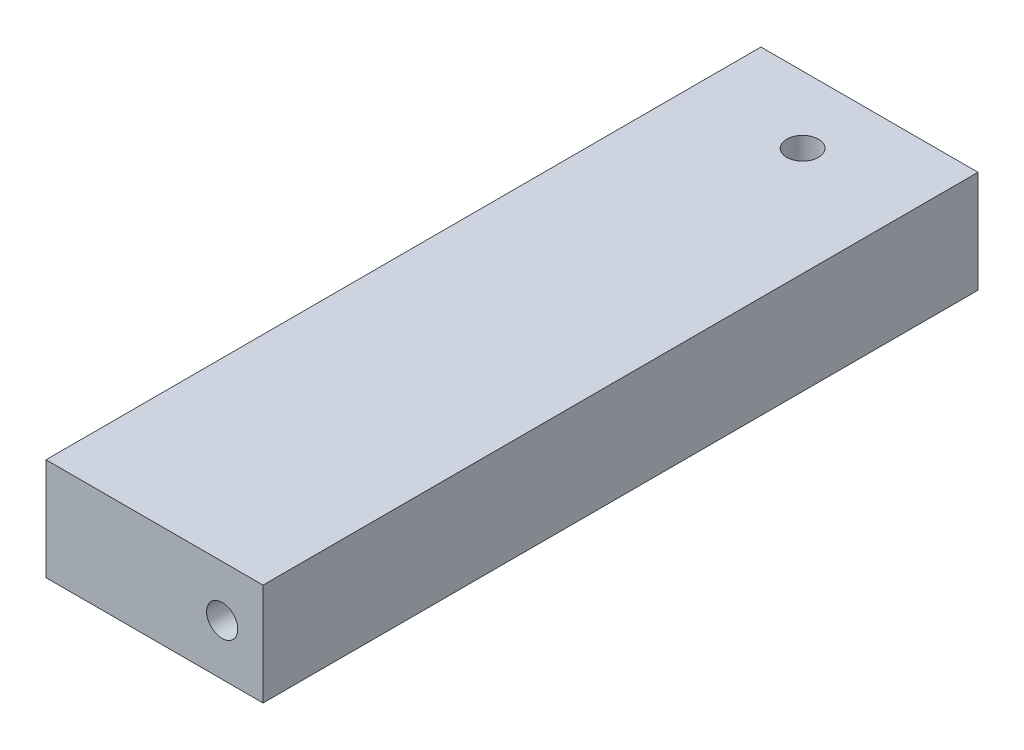
ISO-10303-21;
HEADER;
FILE_DESCRIPTION(('STEP AP214'),'2;1');
FILE_NAME('part.step','',(''),(''),'','','');
FILE_SCHEMA(('AUTOMOTIVE_DESIGN { 1 0 10303 214 1 1 1 1 }'));
ENDSEC;
DATA;
#1=APPLICATION_CONTEXT('core data for automotive mechanical design processes');
#2=APPLICATION_PROTOCOL_DEFINITION('international standard','automotive_design',2000,#1);
#3=PRODUCT_CONTEXT('',#1,'mechanical');
#4=PRODUCT('Part','Part','',(#3));
#5=PRODUCT_RELATED_PRODUCT_CATEGORY('part','',(#4));
#6=PRODUCT_DEFINITION_FORMATION('','',#4);
#7=PRODUCT_DEFINITION_CONTEXT('part definition',#1,'design');
#8=PRODUCT_DEFINITION('design','',#6,#7);
#9=PRODUCT_DEFINITION_SHAPE('','',#8);
#10=(LENGTH_UNIT() NAMED_UNIT(*) SI_UNIT(.MILLI.,.METRE.));
#11=(NAMED_UNIT(*) PLANE_ANGLE_UNIT() SI_UNIT($,.RADIAN.));
#12=(NAMED_UNIT(*) SI_UNIT($,.STERADIAN.) SOLID_ANGLE_UNIT());
#13=UNCERTAINTY_MEASURE_WITH_UNIT(LENGTH_MEASURE(1.E-05),#10,'distance_accuracy_value','');
#14=(GEOMETRIC_REPRESENTATION_CONTEXT(3) GLOBAL_UNCERTAINTY_ASSIGNED_CONTEXT((#13)) GLOBAL_UNIT_ASSIGNED_CONTEXT((#10,
#11,#12)) REPRESENTATION_CONTEXT('',''));
#15=CARTESIAN_POINT('',(0.,0.,0.));
#16=DIRECTION('',(0.,0.,1.));
#17=DIRECTION('',(1.,0.,0.));
#18=AXIS2_PLACEMENT_3D('',#15,#16,#17);
#19=CARTESIAN_POINT('',(-21.2705314009662,11.,-64.118961352657));
#20=DIRECTION('',(1.,0.,0.));
#21=DIRECTION('',(0.,0.,-1.));
#22=AXIS2_PLACEMENT_3D('',#19,#20,#21);
#23=PLANE('',#22);
#24=DIRECTION('',(0.,0.,1.));
#25=VECTOR('',#24,1.);
#26=CARTESIAN_POINT('',(-21.2705314009662,-9.,-64.118961352657));
#27=LINE('',#26,#25);
#28=CARTESIAN_POINT('',(-21.2705314009662,-9.,-64.118961352657));
#29=VERTEX_POINT('',#28);
#30=CARTESIAN_POINT('',(-21.2705314009662,-9.,75.881038647343));
#31=VERTEX_POINT('',#30);
#32=EDGE_CURVE('E102',#29,#31,#27,.T.);
#33=ORIENTED_EDGE('',*,*,#32,.T.);
#34=DIRECTION('',(0.,-1.,0.));
#35=VECTOR('',#34,1.);
#36=CARTESIAN_POINT('',(-21.2705314009662,11.,75.881038647343));
#37=LINE('',#36,#35);
#38=CARTESIAN_POINT('',(-21.2705314009662,11.,75.881038647343));
#39=VERTEX_POINT('',#38);
#40=EDGE_CURVE('E11',#39,#31,#37,.T.);
#41=ORIENTED_EDGE('',*,*,#40,.F.);
#42=DIRECTION('',(0.,0.,1.));
#43=VECTOR('',#42,1.);
#44=CARTESIAN_POINT('',(-21.2705314009662,11.,-64.118961352657));
#45=LINE('',#44,#43);
#46=CARTESIAN_POINT('',(-21.2705314009662,11.,-64.118961352657));
#47=VERTEX_POINT('',#46);
#48=EDGE_CURVE('E90',#47,#39,#45,.T.);
#49=ORIENTED_EDGE('',*,*,#48,.F.);
#50=DIRECTION('',(0.,-1.,0.));
#51=VECTOR('',#50,1.);
#52=CARTESIAN_POINT('',(-21.2705314009662,11.,-64.118961352657));
#53=LINE('',#52,#51);
#54=EDGE_CURVE('E98',#47,#29,#53,.T.);
#55=ORIENTED_EDGE('',*,*,#54,.T.);
#56=EDGE_LOOP('',(#33,#41,#49,#55));
#57=FACE_BOUND('',#56,.T.);
#58=ADVANCED_FACE('F39',(#57),#23,.F.);
#59=CARTESIAN_POINT('',(-21.2705314009662,11.,75.881038647343));
#60=DIRECTION('',(0.,0.,-1.));
#61=DIRECTION('',(-1.,0.,0.));
#62=AXIS2_PLACEMENT_3D('',#59,#60,#61);
#63=PLANE('',#62);
#64=CARTESIAN_POINT('',(13.2294685990338,1.,75.881038647343));
#65=DIRECTION('',(0.,0.,-1.));
#66=DIRECTION('',(-1.,0.,0.));
#67=AXIS2_PLACEMENT_3D('',#64,#65,#66);
#68=CIRCLE('',#67,3.05);
#69=CARTESIAN_POINT('',(10.1794685990338,1.,75.881038647343));
#70=VERTEX_POINT('',#69);
#71=EDGE_CURVE('E105',#70,#70,#68,.T.);
#72=ORIENTED_EDGE('',*,*,#71,.T.);
#73=EDGE_LOOP('',(#72));
#74=FACE_BOUND('',#73,.T.);
#75=DIRECTION('',(1.,0.,0.));
#76=VECTOR('',#75,1.);
#77=CARTESIAN_POINT('',(-21.2705314009662,-9.,75.881038647343));
#78=LINE('',#77,#76);
#79=CARTESIAN_POINT('',(21.2294685990338,-9.,75.881038647343));
#80=VERTEX_POINT('',#79);
#81=EDGE_CURVE('E94',#31,#80,#78,.T.);
#82=ORIENTED_EDGE('',*,*,#81,.T.);
#83=DIRECTION('',(0.,-1.,0.));
#84=VECTOR('',#83,1.);
#85=CARTESIAN_POINT('',(21.2294685990338,11.,75.881038647343));
#86=LINE('',#85,#84);
#87=CARTESIAN_POINT('',(21.2294685990338,11.,75.881038647343));
#88=VERTEX_POINT('',#87);
#89=EDGE_CURVE('E47',#88,#80,#86,.T.);
#90=ORIENTED_EDGE('',*,*,#89,.F.);
#91=DIRECTION('',(1.,0.,0.));
#92=VECTOR('',#91,1.);
#93=CARTESIAN_POINT('',(-21.2705314009662,11.,75.881038647343));
#94=LINE('',#93,#92);
#95=EDGE_CURVE('E85',#39,#88,#94,.T.);
#96=ORIENTED_EDGE('',*,*,#95,.F.);
#97=ORIENTED_EDGE('',*,*,#40,.T.);
#98=EDGE_LOOP('',(#82,#90,#96,#97));
#99=FACE_BOUND('',#98,.T.);
#100=ADVANCED_FACE('F93',(#74,#99),#63,.F.);
#101=CARTESIAN_POINT('',(21.2294685990338,11.,-64.118961352657));
#102=DIRECTION('',(-1.,0.,0.));
#103=DIRECTION('',(0.,0.,1.));
#104=AXIS2_PLACEMENT_3D('',#101,#102,#103);
#105=PLANE('',#104);
#106=DIRECTION('',(0.,0.,-1.));
#107=VECTOR('',#106,1.);
#108=CARTESIAN_POINT('',(21.2294685990338,-9.,-64.118961352657));
#109=LINE('',#108,#107);
#110=CARTESIAN_POINT('',(21.2294685990338,-9.,-64.118961352657));
#111=VERTEX_POINT('',#110);
#112=EDGE_CURVE('E72',#80,#111,#109,.T.);
#113=ORIENTED_EDGE('',*,*,#112,.T.);
#114=DIRECTION('',(0.,-1.,0.));
#115=VECTOR('',#114,1.);
#116=CARTESIAN_POINT('',(21.2294685990338,11.,-64.118961352657));
#117=LINE('',#116,#115);
#118=CARTESIAN_POINT('',(21.2294685990338,11.,-64.118961352657));
#119=VERTEX_POINT('',#118);
#120=EDGE_CURVE('E95',#119,#111,#117,.T.);
#121=ORIENTED_EDGE('',*,*,#120,.F.);
#122=DIRECTION('',(0.,0.,-1.));
#123=VECTOR('',#122,1.);
#124=CARTESIAN_POINT('',(21.2294685990338,11.,-64.118961352657));
#125=LINE('',#124,#123);
#126=EDGE_CURVE('E88',#88,#119,#125,.T.);
#127=ORIENTED_EDGE('',*,*,#126,.F.);
#128=ORIENTED_EDGE('',*,*,#89,.T.);
#129=EDGE_LOOP('',(#113,#121,#127,#128));
#130=FACE_BOUND('',#129,.T.);
#131=ADVANCED_FACE('F96',(#130),#105,.F.);
#132=CARTESIAN_POINT('',(-21.2705314009662,11.,-64.118961352657));
#133=DIRECTION('',(0.,0.,1.));
#134=DIRECTION('',(1.,0.,0.));
#135=AXIS2_PLACEMENT_3D('',#132,#133,#134);
#136=PLANE('',#135);
#137=CARTESIAN_POINT('',(13.2294685990338,1.,-64.118961352657));
#138=DIRECTION('',(0.,0.,-1.));
#139=DIRECTION('',(-1.,0.,0.));
#140=AXIS2_PLACEMENT_3D('',#137,#138,#139);
#141=CIRCLE('',#140,3.05);
#142=CARTESIAN_POINT('',(10.1794685990338,1.,-64.118961352657));
#143=VERTEX_POINT('',#142);
#144=EDGE_CURVE('E116',#143,#143,#141,.T.);
#145=ORIENTED_EDGE('',*,*,#144,.F.);
#146=EDGE_LOOP('',(#145));
#147=FACE_BOUND('',#146,.T.);
#148=DIRECTION('',(-1.,0.,0.));
#149=VECTOR('',#148,1.);
#150=CARTESIAN_POINT('',(-21.2705314009662,-9.,-64.118961352657));
#151=LINE('',#150,#149);
#152=EDGE_CURVE('E78',#111,#29,#151,.T.);
#153=ORIENTED_EDGE('',*,*,#152,.T.);
#154=ORIENTED_EDGE('',*,*,#54,.F.);
#155=DIRECTION('',(-1.,0.,0.));
#156=VECTOR('',#155,1.);
#157=CARTESIAN_POINT('',(-21.2705314009662,11.,-64.118961352657));
#158=LINE('',#157,#156);
#159=EDGE_CURVE('E55',#119,#47,#158,.T.);
#160=ORIENTED_EDGE('',*,*,#159,.F.);
#161=ORIENTED_EDGE('',*,*,#120,.T.);
#162=EDGE_LOOP('',(#153,#154,#160,#161));
#163=FACE_BOUND('',#162,.T.);
#164=ADVANCED_FACE('F110',(#147,#163),#136,.F.);
#165=CARTESIAN_POINT('',(0.184782608695651,11.,-52.929347826087));
#166=DIRECTION('',(0.,1.,0.));
#167=DIRECTION('',(0.,0.,1.));
#168=AXIS2_PLACEMENT_3D('',#165,#166,#167);
#169=PLANE('',#168);
#170=CARTESIAN_POINT('',(-0.0205314009661742,11.,-51.018961352657));
#171=DIRECTION('',(0.,1.,0.));
#172=DIRECTION('',(0.,0.,1.));
#173=AXIS2_PLACEMENT_3D('',#170,#171,#172);
#174=CIRCLE('',#173,3.1);
#175=CARTESIAN_POINT('',(-0.0205314009661742,11.,-47.918961352657));
#176=VERTEX_POINT('',#175);
#177=EDGE_CURVE('E122',#176,#176,#174,.T.);
#178=ORIENTED_EDGE('',*,*,#177,.F.);
#179=EDGE_LOOP('',(#178));
#180=FACE_BOUND('',#179,.T.);
#181=ORIENTED_EDGE('',*,*,#48,.T.);
#182=ORIENTED_EDGE('',*,*,#95,.T.);
#183=ORIENTED_EDGE('',*,*,#126,.T.);
#184=ORIENTED_EDGE('',*,*,#159,.T.);
#185=EDGE_LOOP('',(#181,#182,#183,#184));
#186=FACE_BOUND('',#185,.T.);
#187=ADVANCED_FACE('F86',(#180,#186),#169,.T.);
#188=CARTESIAN_POINT('',(0.184782608695651,-9.,-52.929347826087));
#189=DIRECTION('',(0.,1.,0.));
#190=DIRECTION('',(0.,0.,1.));
#191=AXIS2_PLACEMENT_3D('',#188,#189,#190);
#192=PLANE('',#191);
#193=CARTESIAN_POINT('',(-0.0205314009661742,-9.,-51.018961352657));
#194=DIRECTION('',(0.,1.,0.));
#195=DIRECTION('',(0.,0.,1.));
#196=AXIS2_PLACEMENT_3D('',#193,#194,#195);
#197=CIRCLE('',#196,3.1);
#198=CARTESIAN_POINT('',(-0.0205314009661742,-9.,-47.918961352657));
#199=VERTEX_POINT('',#198);
#200=EDGE_CURVE('E119',#199,#199,#197,.T.);
#201=ORIENTED_EDGE('',*,*,#200,.T.);
#202=EDGE_LOOP('',(#201));
#203=FACE_BOUND('',#202,.T.);
#204=ORIENTED_EDGE('',*,*,#32,.F.);
#205=ORIENTED_EDGE('',*,*,#152,.F.);
#206=ORIENTED_EDGE('',*,*,#112,.F.);
#207=ORIENTED_EDGE('',*,*,#81,.F.);
#208=EDGE_LOOP('',(#204,#205,#206,#207));
#209=FACE_BOUND('',#208,.T.);
#210=ADVANCED_FACE('F113',(#203,#209),#192,.F.);
#211=CARTESIAN_POINT('',(13.2294685990338,1.,75.881038647343));
#212=DIRECTION('',(0.,0.,-1.));
#213=DIRECTION('',(-1.,0.,0.));
#214=AXIS2_PLACEMENT_3D('',#211,#212,#213);
#215=CYLINDRICAL_SURFACE('',#214,3.05);
#216=ORIENTED_EDGE('',*,*,#71,.F.);
#217=EDGE_LOOP('',(#216));
#218=FACE_BOUND('',#217,.T.);
#219=ORIENTED_EDGE('',*,*,#144,.T.);
#220=EDGE_LOOP('',(#219));
#221=FACE_BOUND('',#220,.T.);
#222=ADVANCED_FACE('F132',(#218,#221),#215,.F.);
#223=CARTESIAN_POINT('',(-0.0205314009661742,-9.,-51.018961352657));
#224=DIRECTION('',(0.,1.,0.));
#225=DIRECTION('',(0.,0.,1.));
#226=AXIS2_PLACEMENT_3D('',#223,#224,#225);
#227=CYLINDRICAL_SURFACE('',#226,3.1);
#228=ORIENTED_EDGE('',*,*,#200,.F.);
#229=EDGE_LOOP('',(#228));
#230=FACE_BOUND('',#229,.T.);
#231=ORIENTED_EDGE('',*,*,#177,.T.);
#232=EDGE_LOOP('',(#231));
#233=FACE_BOUND('',#232,.T.);
#234=ADVANCED_FACE('F129',(#230,#233),#227,.F.);
#235=CLOSED_SHELL('',(#58,#100,#131,#164,#187,#210,#222,#234));
#236=MANIFOLD_SOLID_BREP('B2',#235);
#237=ADVANCED_BREP_SHAPE_REPRESENTATION('',(#18,#236),#14);
#238=SHAPE_DEFINITION_REPRESENTATION(#9,#237);
ENDSEC;
END-ISO-10303-21;
